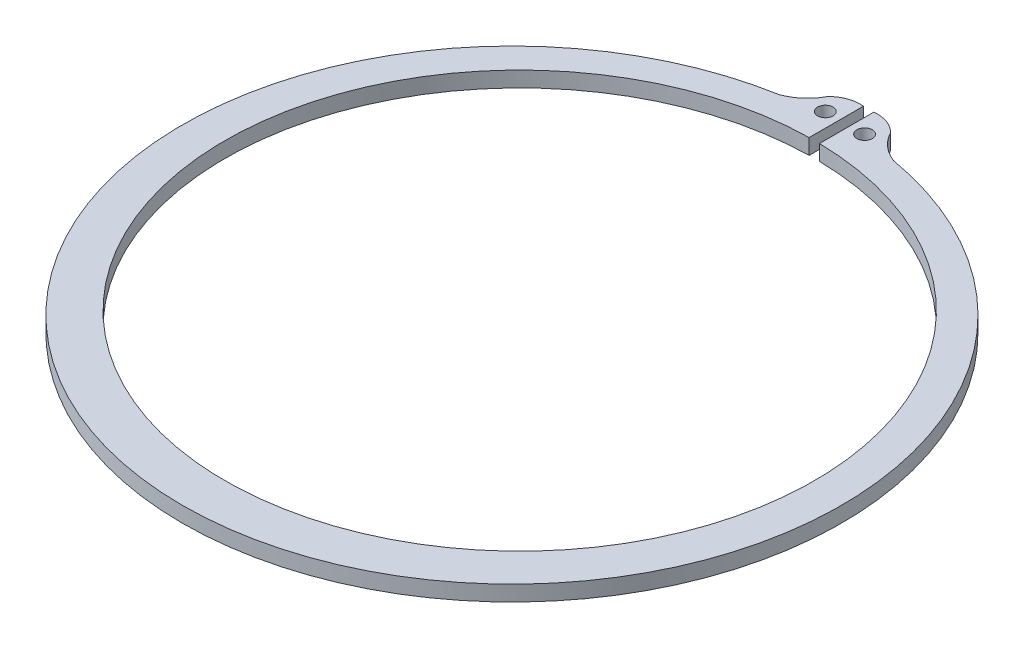
ISO-10303-21;
HEADER;
FILE_DESCRIPTION(('STEP AP214'),'2;1');
FILE_NAME('part.step','',(''),(''),'','','');
FILE_SCHEMA(('AUTOMOTIVE_DESIGN { 1 0 10303 214 1 1 1 1 }'));
ENDSEC;
DATA;
#1=APPLICATION_CONTEXT('core data for automotive mechanical design processes');
#2=APPLICATION_PROTOCOL_DEFINITION('international standard','automotive_design',2000,#1);
#3=PRODUCT_CONTEXT('',#1,'mechanical');
#4=PRODUCT('Part','Part','',(#3));
#5=PRODUCT_RELATED_PRODUCT_CATEGORY('part','',(#4));
#6=PRODUCT_DEFINITION_FORMATION('','',#4);
#7=PRODUCT_DEFINITION_CONTEXT('part definition',#1,'design');
#8=PRODUCT_DEFINITION('design','',#6,#7);
#9=PRODUCT_DEFINITION_SHAPE('','',#8);
#10=(LENGTH_UNIT() NAMED_UNIT(*) SI_UNIT(.MILLI.,.METRE.));
#11=(NAMED_UNIT(*) PLANE_ANGLE_UNIT() SI_UNIT($,.RADIAN.));
#12=(NAMED_UNIT(*) SI_UNIT($,.STERADIAN.) SOLID_ANGLE_UNIT());
#13=UNCERTAINTY_MEASURE_WITH_UNIT(LENGTH_MEASURE(1.E-05),#10,'distance_accuracy_value','');
#14=(GEOMETRIC_REPRESENTATION_CONTEXT(3) GLOBAL_UNCERTAINTY_ASSIGNED_CONTEXT((#13)) GLOBAL_UNIT_ASSIGNED_CONTEXT((#10,
#11,#12)) REPRESENTATION_CONTEXT('',''));
#15=CARTESIAN_POINT('',(0.,0.,0.));
#16=DIRECTION('',(0.,0.,1.));
#17=DIRECTION('',(1.,0.,0.));
#18=AXIS2_PLACEMENT_3D('',#15,#16,#17);
#19=CARTESIAN_POINT('',(-1.12698566697298,2.,-40.985253139772));
#20=DIRECTION('',(0.,-1.,0.));
#21=DIRECTION('',(0.,0.,-1.));
#22=AXIS2_PLACEMENT_3D('',#19,#20,#21);
#23=CYLINDRICAL_SURFACE('',#22,4.03523982190281);
#24=CARTESIAN_POINT('',(-1.12698566697298,0.,-40.985253139772));
#25=DIRECTION('',(0.,1.,0.));
#26=DIRECTION('',(0.,0.,1.));
#27=AXIS2_PLACEMENT_3D('',#24,#25,#26);
#28=CIRCLE('',#27,4.03523982190281);
#29=CARTESIAN_POINT('',(-0.666666666666668,0.,-44.9941515967334));
#30=VERTEX_POINT('',#29);
#31=CARTESIAN_POINT('',(-4.04116154721329,0.,-43.7764427354992));
#32=VERTEX_POINT('',#31);
#33=EDGE_CURVE('E129',#30,#32,#28,.T.);
#34=ORIENTED_EDGE('',*,*,#33,.T.);
#35=DIRECTION('',(0.,-1.,0.));
#36=VECTOR('',#35,1.);
#37=CARTESIAN_POINT('',(-4.04116154721329,2.,-43.7764427354992));
#38=LINE('',#37,#36);
#39=CARTESIAN_POINT('',(-4.04116154721329,2.,-43.7764427354992));
#40=VERTEX_POINT('',#39);
#41=EDGE_CURVE('E11',#40,#32,#38,.T.);
#42=ORIENTED_EDGE('',*,*,#41,.F.);
#43=CARTESIAN_POINT('',(-1.12698566697298,2.,-40.985253139772));
#44=DIRECTION('',(0.,1.,0.));
#45=DIRECTION('',(0.,0.,1.));
#46=AXIS2_PLACEMENT_3D('',#43,#44,#45);
#47=CIRCLE('',#46,4.03523982190281);
#48=CARTESIAN_POINT('',(-0.666666666666668,2.,-44.9941515967334));
#49=VERTEX_POINT('',#48);
#50=EDGE_CURVE('E144',#49,#40,#47,.T.);
#51=ORIENTED_EDGE('',*,*,#50,.F.);
#52=DIRECTION('',(0.,-1.,0.));
#53=VECTOR('',#52,1.);
#54=CARTESIAN_POINT('',(-0.666666666666668,2.,-44.9941515967334));
#55=LINE('',#54,#53);
#56=EDGE_CURVE('E125',#49,#30,#55,.T.);
#57=ORIENTED_EDGE('',*,*,#56,.T.);
#58=EDGE_LOOP('',(#34,#42,#51,#57));
#59=FACE_BOUND('',#58,.T.);
#60=ADVANCED_FACE('F33',(#59),#23,.T.);
#61=CARTESIAN_POINT('',(-9.54069149050613,2.,-46.6843403561482));
#62=DIRECTION('',(0.,-1.,0.));
#63=DIRECTION('',(0.,0.,-1.));
#64=AXIS2_PLACEMENT_3D('',#61,#62,#63);
#65=CYLINDRICAL_SURFACE('',#64,6.22098852027157);
#66=CARTESIAN_POINT('',(-9.54069149050613,0.,-46.6843403561482));
#67=DIRECTION('',(0.,-1.,0.));
#68=DIRECTION('',(0.,0.,-1.));
#69=AXIS2_PLACEMENT_3D('',#66,#67,#68);
#70=CIRCLE('',#69,6.22098852027157);
#71=CARTESIAN_POINT('',(-7.36112355908337,0.,-40.8576619025467));
#72=VERTEX_POINT('',#71);
#73=EDGE_CURVE('E132',#32,#72,#70,.T.);
#74=ORIENTED_EDGE('',*,*,#73,.T.);
#75=DIRECTION('',(0.,-1.,0.));
#76=VECTOR('',#75,1.);
#77=CARTESIAN_POINT('',(-7.36112355908337,2.,-40.8576619025467));
#78=LINE('',#77,#76);
#79=CARTESIAN_POINT('',(-7.36112355908337,2.,-40.8576619025467));
#80=VERTEX_POINT('',#79);
#81=EDGE_CURVE('E41',#80,#72,#78,.T.);
#82=ORIENTED_EDGE('',*,*,#81,.F.);
#83=CARTESIAN_POINT('',(-9.54069149050613,2.,-46.6843403561482));
#84=DIRECTION('',(0.,-1.,0.));
#85=DIRECTION('',(0.,0.,-1.));
#86=AXIS2_PLACEMENT_3D('',#83,#84,#85);
#87=CIRCLE('',#86,6.22098852027157);
#88=EDGE_CURVE('E92',#40,#80,#87,.T.);
#89=ORIENTED_EDGE('',*,*,#88,.F.);
#90=ORIENTED_EDGE('',*,*,#41,.T.);
#91=EDGE_LOOP('',(#74,#82,#89,#90));
#92=FACE_BOUND('',#91,.T.);
#93=ADVANCED_FACE('F213',(#92),#65,.F.);
#94=CARTESIAN_POINT('',(0.,2.,0.999999999999992));
#95=DIRECTION('',(0.,-1.,0.));
#96=DIRECTION('',(0.,0.,-1.));
#97=AXIS2_PLACEMENT_3D('',#94,#95,#96);
#98=CYLINDRICAL_SURFACE('',#97,42.5);
#99=CARTESIAN_POINT('',(0.,0.,0.999999999999992));
#100=DIRECTION('',(0.,1.,0.));
#101=DIRECTION('',(0.,0.,1.));
#102=AXIS2_PLACEMENT_3D('',#99,#100,#101);
#103=CIRCLE('',#102,42.5);
#104=CARTESIAN_POINT('',(7.36112355908337,0.,-40.8576619025467));
#105=VERTEX_POINT('',#104);
#106=EDGE_CURVE('E135',#72,#105,#103,.T.);
#107=ORIENTED_EDGE('',*,*,#106,.T.);
#108=DIRECTION('',(0.,-1.,0.));
#109=VECTOR('',#108,1.);
#110=CARTESIAN_POINT('',(7.36112355908337,2.,-40.8576619025467));
#111=LINE('',#110,#109);
#112=CARTESIAN_POINT('',(7.36112355908337,2.,-40.8576619025467));
#113=VERTEX_POINT('',#112);
#114=EDGE_CURVE('E151',#113,#105,#111,.T.);
#115=ORIENTED_EDGE('',*,*,#114,.F.);
#116=CARTESIAN_POINT('',(0.,2.,0.999999999999992));
#117=DIRECTION('',(0.,1.,0.));
#118=DIRECTION('',(0.,0.,1.));
#119=AXIS2_PLACEMENT_3D('',#116,#117,#118);
#120=CIRCLE('',#119,42.5);
#121=EDGE_CURVE('E159',#80,#113,#120,.T.);
#122=ORIENTED_EDGE('',*,*,#121,.F.);
#123=ORIENTED_EDGE('',*,*,#81,.T.);
#124=EDGE_LOOP('',(#107,#115,#122,#123));
#125=FACE_BOUND('',#124,.T.);
#126=ADVANCED_FACE('F157',(#125),#98,.T.);
#127=CARTESIAN_POINT('',(9.54069149050613,2.,-46.6843403561482));
#128=DIRECTION('',(0.,-1.,0.));
#129=DIRECTION('',(0.,0.,-1.));
#130=AXIS2_PLACEMENT_3D('',#127,#128,#129);
#131=CYLINDRICAL_SURFACE('',#130,6.22098852027157);
#132=CARTESIAN_POINT('',(9.54069149050613,0.,-46.6843403561482));
#133=DIRECTION('',(0.,-1.,0.));
#134=DIRECTION('',(0.,0.,1.));
#135=AXIS2_PLACEMENT_3D('',#132,#133,#134);
#136=CIRCLE('',#135,6.22098852027157);
#137=CARTESIAN_POINT('',(4.04116154721329,0.,-43.7764427354992));
#138=VERTEX_POINT('',#137);
#139=EDGE_CURVE('E137',#105,#138,#136,.T.);
#140=ORIENTED_EDGE('',*,*,#139,.T.);
#141=DIRECTION('',(0.,-1.,0.));
#142=VECTOR('',#141,1.);
#143=CARTESIAN_POINT('',(4.04116154721329,2.,-43.7764427354992));
#144=LINE('',#143,#142);
#145=CARTESIAN_POINT('',(4.04116154721329,2.,-43.7764427354992));
#146=VERTEX_POINT('',#145);
#147=EDGE_CURVE('E148',#146,#138,#144,.T.);
#148=ORIENTED_EDGE('',*,*,#147,.F.);
#149=CARTESIAN_POINT('',(9.54069149050613,2.,-46.6843403561482));
#150=DIRECTION('',(0.,-1.,0.));
#151=DIRECTION('',(0.,0.,1.));
#152=AXIS2_PLACEMENT_3D('',#149,#150,#151);
#153=CIRCLE('',#152,6.22098852027157);
#154=EDGE_CURVE('E171',#113,#146,#153,.T.);
#155=ORIENTED_EDGE('',*,*,#154,.F.);
#156=ORIENTED_EDGE('',*,*,#114,.T.);
#157=EDGE_LOOP('',(#140,#148,#155,#156));
#158=FACE_BOUND('',#157,.T.);
#159=ADVANCED_FACE('F167',(#158),#131,.F.);
#160=CARTESIAN_POINT('',(1.12698566697298,2.,-40.985253139772));
#161=DIRECTION('',(0.,-1.,0.));
#162=DIRECTION('',(0.,0.,-1.));
#163=AXIS2_PLACEMENT_3D('',#160,#161,#162);
#164=CYLINDRICAL_SURFACE('',#163,4.03523982190281);
#165=CARTESIAN_POINT('',(1.12698566697298,0.,-40.985253139772));
#166=DIRECTION('',(0.,1.,0.));
#167=DIRECTION('',(0.,0.,-1.));
#168=AXIS2_PLACEMENT_3D('',#165,#166,#167);
#169=CIRCLE('',#168,4.03523982190281);
#170=CARTESIAN_POINT('',(0.666666666666668,0.,-44.9941515967334));
#171=VERTEX_POINT('',#170);
#172=EDGE_CURVE('E139',#138,#171,#169,.T.);
#173=ORIENTED_EDGE('',*,*,#172,.T.);
#174=DIRECTION('',(0.,-1.,0.));
#175=VECTOR('',#174,1.);
#176=CARTESIAN_POINT('',(0.666666666666668,2.,-44.9941515967334));
#177=LINE('',#176,#175);
#178=CARTESIAN_POINT('',(0.666666666666668,2.,-44.9941515967334));
#179=VERTEX_POINT('',#178);
#180=EDGE_CURVE('E120',#179,#171,#177,.T.);
#181=ORIENTED_EDGE('',*,*,#180,.F.);
#182=CARTESIAN_POINT('',(1.12698566697298,2.,-40.985253139772));
#183=DIRECTION('',(0.,1.,0.));
#184=DIRECTION('',(0.,0.,-1.));
#185=AXIS2_PLACEMENT_3D('',#182,#183,#184);
#186=CIRCLE('',#185,4.03523982190281);
#187=EDGE_CURVE('E111',#146,#179,#186,.T.);
#188=ORIENTED_EDGE('',*,*,#187,.F.);
#189=ORIENTED_EDGE('',*,*,#147,.T.);
#190=EDGE_LOOP('',(#173,#181,#188,#189));
#191=FACE_BOUND('',#190,.T.);
#192=ADVANCED_FACE('F170',(#191),#164,.T.);
#193=CARTESIAN_POINT('',(0.666666666666668,2.,-44.9941515967334));
#194=DIRECTION('',(1.,0.,0.));
#195=DIRECTION('',(0.,0.,-1.));
#196=AXIS2_PLACEMENT_3D('',#193,#194,#195);
#197=PLANE('',#196);
#198=DIRECTION('',(0.,0.,1.));
#199=VECTOR('',#198,1.);
#200=CARTESIAN_POINT('',(0.666666666666668,0.,-44.9941515967334));
#201=LINE('',#200,#199);
#202=CARTESIAN_POINT('',(0.666666666666659,0.,-37.9941515967334));
#203=VERTEX_POINT('',#202);
#204=EDGE_CURVE('E119',#171,#203,#201,.T.);
#205=ORIENTED_EDGE('',*,*,#204,.T.);
#206=DIRECTION('',(0.,-1.,0.));
#207=VECTOR('',#206,1.);
#208=CARTESIAN_POINT('',(0.666666666666659,2.,-37.9941515967334));
#209=LINE('',#208,#207);
#210=CARTESIAN_POINT('',(0.666666666666659,2.,-37.9941515967334));
#211=VERTEX_POINT('',#210);
#212=EDGE_CURVE('E116',#211,#203,#209,.T.);
#213=ORIENTED_EDGE('',*,*,#212,.F.);
#214=DIRECTION('',(0.,0.,1.));
#215=VECTOR('',#214,1.);
#216=CARTESIAN_POINT('',(0.666666666666668,2.,-44.9941515967334));
#217=LINE('',#216,#215);
#218=EDGE_CURVE('E105',#179,#211,#217,.T.);
#219=ORIENTED_EDGE('',*,*,#218,.F.);
#220=ORIENTED_EDGE('',*,*,#180,.T.);
#221=EDGE_LOOP('',(#205,#213,#219,#220));
#222=FACE_BOUND('',#221,.T.);
#223=ADVANCED_FACE('F117',(#222),#197,.F.);
#224=CARTESIAN_POINT('',(0.,2.,0.));
#225=DIRECTION('',(0.,-1.,0.));
#226=DIRECTION('',(0.,0.,-1.));
#227=AXIS2_PLACEMENT_3D('',#224,#225,#226);
#228=CYLINDRICAL_SURFACE('',#227,38.);
#229=CARTESIAN_POINT('',(0.,0.,0.));
#230=DIRECTION('',(0.,-1.,0.));
#231=DIRECTION('',(0.,0.,1.));
#232=AXIS2_PLACEMENT_3D('',#229,#230,#231);
#233=CIRCLE('',#232,38.);
#234=CARTESIAN_POINT('',(-0.666666666666667,0.,-37.9941515967334));
#235=VERTEX_POINT('',#234);
#236=EDGE_CURVE('E78',#203,#235,#233,.T.);
#237=ORIENTED_EDGE('',*,*,#236,.T.);
#238=DIRECTION('',(0.,-1.,0.));
#239=VECTOR('',#238,1.);
#240=CARTESIAN_POINT('',(-0.666666666666667,2.,-37.9941515967334));
#241=LINE('',#240,#239);
#242=CARTESIAN_POINT('',(-0.666666666666667,2.,-37.9941515967334));
#243=VERTEX_POINT('',#242);
#244=EDGE_CURVE('E121',#243,#235,#241,.T.);
#245=ORIENTED_EDGE('',*,*,#244,.F.);
#246=CARTESIAN_POINT('',(0.,2.,0.));
#247=DIRECTION('',(0.,-1.,0.));
#248=DIRECTION('',(0.,0.,1.));
#249=AXIS2_PLACEMENT_3D('',#246,#247,#248);
#250=CIRCLE('',#249,38.);
#251=EDGE_CURVE('E109',#211,#243,#250,.T.);
#252=ORIENTED_EDGE('',*,*,#251,.F.);
#253=ORIENTED_EDGE('',*,*,#212,.T.);
#254=EDGE_LOOP('',(#237,#245,#252,#253));
#255=FACE_BOUND('',#254,.T.);
#256=ADVANCED_FACE('F123',(#255),#228,.F.);
#257=CARTESIAN_POINT('',(-0.666666666666668,2.,-44.9941515967334));
#258=DIRECTION('',(-1.,0.,0.));
#259=DIRECTION('',(0.,0.,1.));
#260=AXIS2_PLACEMENT_3D('',#257,#258,#259);
#261=PLANE('',#260);
#262=DIRECTION('',(0.,0.,-1.));
#263=VECTOR('',#262,1.);
#264=CARTESIAN_POINT('',(-0.666666666666668,0.,-44.9941515967334));
#265=LINE('',#264,#263);
#266=EDGE_CURVE('E84',#235,#30,#265,.T.);
#267=ORIENTED_EDGE('',*,*,#266,.T.);
#268=ORIENTED_EDGE('',*,*,#56,.F.);
#269=DIRECTION('',(0.,0.,-1.));
#270=VECTOR('',#269,1.);
#271=CARTESIAN_POINT('',(-0.666666666666668,2.,-44.9941515967334));
#272=LINE('',#271,#270);
#273=EDGE_CURVE('E49',#243,#49,#272,.T.);
#274=ORIENTED_EDGE('',*,*,#273,.F.);
#275=ORIENTED_EDGE('',*,*,#244,.T.);
#276=EDGE_LOOP('',(#267,#268,#274,#275));
#277=FACE_BOUND('',#276,.T.);
#278=ADVANCED_FACE('F200',(#277),#261,.F.);
#279=CARTESIAN_POINT('',(-1.12698566697298,2.,-40.985253139772));
#280=DIRECTION('',(0.,1.,0.));
#281=DIRECTION('',(0.,0.,1.));
#282=AXIS2_PLACEMENT_3D('',#279,#280,#281);
#283=PLANE('',#282);
#284=CARTESIAN_POINT('',(2.53228615286641,2.,-41.9441425364135));
#285=DIRECTION('',(0.,1.,0.));
#286=DIRECTION('',(0.,0.,-1.));
#287=AXIS2_PLACEMENT_3D('',#284,#285,#286);
#288=CIRCLE('',#287,0.995647448698265);
#289=CARTESIAN_POINT('',(2.53228615286641,2.,-42.9397899851118));
#290=VERTEX_POINT('',#289);
#291=EDGE_CURVE('E183',#290,#290,#288,.T.);
#292=ORIENTED_EDGE('',*,*,#291,.F.);
#293=EDGE_LOOP('',(#292));
#294=FACE_BOUND('',#293,.T.);
#295=CARTESIAN_POINT('',(-2.53228615286641,2.,-41.9441425364135));
#296=DIRECTION('',(0.,1.,0.));
#297=DIRECTION('',(0.,0.,1.));
#298=AXIS2_PLACEMENT_3D('',#295,#296,#297);
#299=CIRCLE('',#298,0.995647448698265);
#300=CARTESIAN_POINT('',(-2.53228615286641,2.,-40.9484950877152));
#301=VERTEX_POINT('',#300);
#302=EDGE_CURVE('E177',#301,#301,#299,.T.);
#303=ORIENTED_EDGE('',*,*,#302,.F.);
#304=EDGE_LOOP('',(#303));
#305=FACE_BOUND('',#304,.T.);
#306=ORIENTED_EDGE('',*,*,#50,.T.);
#307=ORIENTED_EDGE('',*,*,#88,.T.);
#308=ORIENTED_EDGE('',*,*,#121,.T.);
#309=ORIENTED_EDGE('',*,*,#154,.T.);
#310=ORIENTED_EDGE('',*,*,#187,.T.);
#311=ORIENTED_EDGE('',*,*,#218,.T.);
#312=ORIENTED_EDGE('',*,*,#251,.T.);
#313=ORIENTED_EDGE('',*,*,#273,.T.);
#314=EDGE_LOOP('',(#306,#307,#308,#309,#310,#311,#312,#313));
#315=FACE_BOUND('',#314,.T.);
#316=ADVANCED_FACE('F107',(#294,#305,#315),#283,.T.);
#317=CARTESIAN_POINT('',(-1.12698566697298,0.,-40.985253139772));
#318=DIRECTION('',(0.,1.,0.));
#319=DIRECTION('',(0.,0.,1.));
#320=AXIS2_PLACEMENT_3D('',#317,#318,#319);
#321=PLANE('',#320);
#322=CARTESIAN_POINT('',(2.53228615286641,0.,-41.9441425364135));
#323=DIRECTION('',(0.,1.,0.));
#324=DIRECTION('',(0.,0.,-1.));
#325=AXIS2_PLACEMENT_3D('',#322,#323,#324);
#326=CIRCLE('',#325,0.995647448698265);
#327=CARTESIAN_POINT('',(2.53228615286641,0.,-42.9397899851118));
#328=VERTEX_POINT('',#327);
#329=EDGE_CURVE('E180',#328,#328,#326,.T.);
#330=ORIENTED_EDGE('',*,*,#329,.T.);
#331=EDGE_LOOP('',(#330));
#332=FACE_BOUND('',#331,.T.);
#333=CARTESIAN_POINT('',(-2.53228615286641,0.,-41.9441425364135));
#334=DIRECTION('',(0.,1.,0.));
#335=DIRECTION('',(0.,0.,1.));
#336=AXIS2_PLACEMENT_3D('',#333,#334,#335);
#337=CIRCLE('',#336,0.995647448698265);
#338=CARTESIAN_POINT('',(-2.53228615286641,0.,-40.9484950877152));
#339=VERTEX_POINT('',#338);
#340=EDGE_CURVE('E133',#339,#339,#337,.T.);
#341=ORIENTED_EDGE('',*,*,#340,.T.);
#342=EDGE_LOOP('',(#341));
#343=FACE_BOUND('',#342,.T.);
#344=ORIENTED_EDGE('',*,*,#33,.F.);
#345=ORIENTED_EDGE('',*,*,#266,.F.);
#346=ORIENTED_EDGE('',*,*,#236,.F.);
#347=ORIENTED_EDGE('',*,*,#204,.F.);
#348=ORIENTED_EDGE('',*,*,#172,.F.);
#349=ORIENTED_EDGE('',*,*,#139,.F.);
#350=ORIENTED_EDGE('',*,*,#106,.F.);
#351=ORIENTED_EDGE('',*,*,#73,.F.);
#352=EDGE_LOOP('',(#344,#345,#346,#347,#348,#349,#350,#351));
#353=FACE_BOUND('',#352,.T.);
#354=ADVANCED_FACE('F163',(#332,#343,#353),#321,.F.);
#355=CARTESIAN_POINT('',(-2.53228615286641,0.,-41.9441425364135));
#356=DIRECTION('',(0.,1.,0.));
#357=DIRECTION('',(0.,0.,1.));
#358=AXIS2_PLACEMENT_3D('',#355,#356,#357);
#359=CYLINDRICAL_SURFACE('',#358,0.995647448698265);
#360=ORIENTED_EDGE('',*,*,#340,.F.);
#361=EDGE_LOOP('',(#360));
#362=FACE_BOUND('',#361,.T.);
#363=ORIENTED_EDGE('',*,*,#302,.T.);
#364=EDGE_LOOP('',(#363));
#365=FACE_BOUND('',#364,.T.);
#366=ADVANCED_FACE('F194',(#362,#365),#359,.F.);
#367=CARTESIAN_POINT('',(2.53228615286641,0.,-41.9441425364135));
#368=DIRECTION('',(0.,1.,0.));
#369=DIRECTION('',(0.,0.,1.));
#370=AXIS2_PLACEMENT_3D('',#367,#368,#369);
#371=CYLINDRICAL_SURFACE('',#370,0.995647448698265);
#372=ORIENTED_EDGE('',*,*,#329,.F.);
#373=EDGE_LOOP('',(#372));
#374=FACE_BOUND('',#373,.T.);
#375=ORIENTED_EDGE('',*,*,#291,.T.);
#376=EDGE_LOOP('',(#375));
#377=FACE_BOUND('',#376,.T.);
#378=ADVANCED_FACE('F191',(#374,#377),#371,.F.);
#379=CLOSED_SHELL('',(#60,#93,#126,#159,#192,#223,#256,#278,#316,#354,#366,#378));
#380=MANIFOLD_SOLID_BREP('B2',#379);
#381=ADVANCED_BREP_SHAPE_REPRESENTATION('',(#18,#380),#14);
#382=SHAPE_DEFINITION_REPRESENTATION(#9,#381);
ENDSEC;
END-ISO-10303-21;
